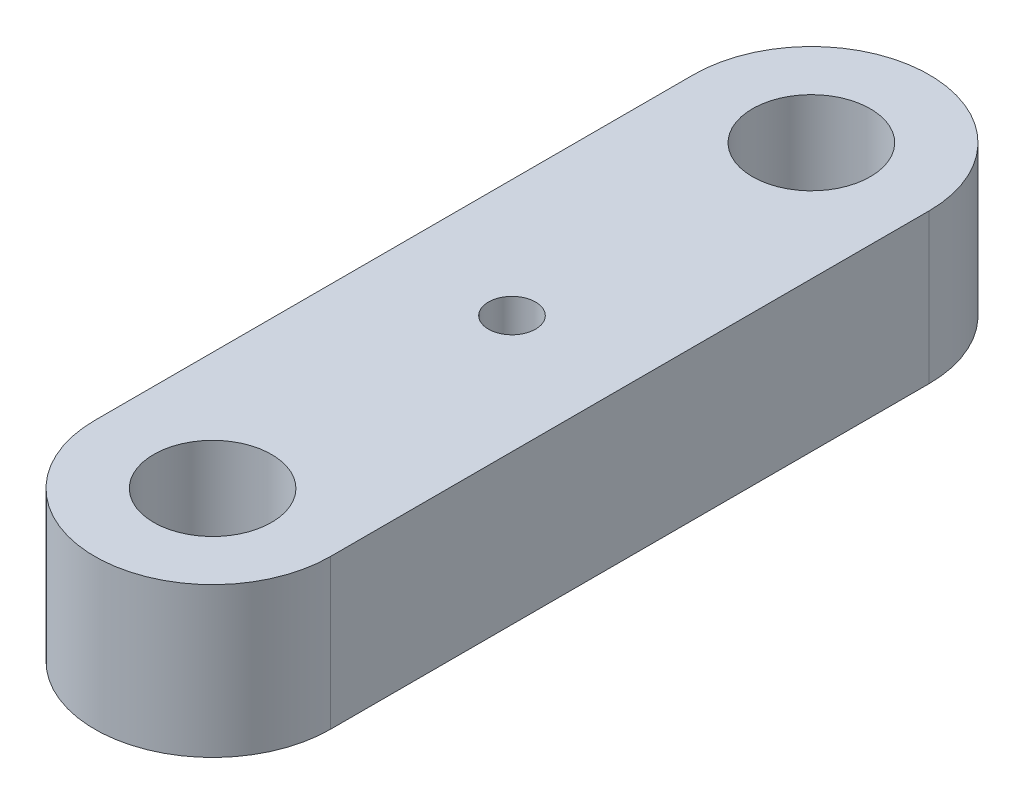
ISO-10303-21;
HEADER;
FILE_DESCRIPTION(('STEP AP214'),'2;1');
FILE_NAME('part.step','',(''),(''),'','','');
FILE_SCHEMA(('AUTOMOTIVE_DESIGN { 1 0 10303 214 1 1 1 1 }'));
ENDSEC;
DATA;
#1=APPLICATION_CONTEXT('core data for automotive mechanical design processes');
#2=APPLICATION_PROTOCOL_DEFINITION('international standard','automotive_design',2000,#1);
#3=PRODUCT_CONTEXT('',#1,'mechanical');
#4=PRODUCT('Part','Part','',(#3));
#5=PRODUCT_RELATED_PRODUCT_CATEGORY('part','',(#4));
#6=PRODUCT_DEFINITION_FORMATION('','',#4);
#7=PRODUCT_DEFINITION_CONTEXT('part definition',#1,'design');
#8=PRODUCT_DEFINITION('design','',#6,#7);
#9=PRODUCT_DEFINITION_SHAPE('','',#8);
#10=(LENGTH_UNIT() NAMED_UNIT(*) SI_UNIT(.MILLI.,.METRE.));
#11=(NAMED_UNIT(*) PLANE_ANGLE_UNIT() SI_UNIT($,.RADIAN.));
#12=(NAMED_UNIT(*) SI_UNIT($,.STERADIAN.) SOLID_ANGLE_UNIT());
#13=UNCERTAINTY_MEASURE_WITH_UNIT(LENGTH_MEASURE(1.E-05),#10,'distance_accuracy_value','');
#14=(GEOMETRIC_REPRESENTATION_CONTEXT(3) GLOBAL_UNCERTAINTY_ASSIGNED_CONTEXT((#13)) GLOBAL_UNIT_ASSIGNED_CONTEXT((#10,
#11,#12)) REPRESENTATION_CONTEXT('',''));
#15=CARTESIAN_POINT('',(0.,0.,0.));
#16=DIRECTION('',(0.,0.,1.));
#17=DIRECTION('',(1.,0.,0.));
#18=AXIS2_PLACEMENT_3D('',#15,#16,#17);
#19=CARTESIAN_POINT('',(0.,3.175,6.35));
#20=DIRECTION('',(0.,1.,0.));
#21=DIRECTION('',(0.,0.,1.));
#22=AXIS2_PLACEMENT_3D('',#19,#20,#21);
#23=PLANE('',#22);
#24=CARTESIAN_POINT('',(0.,3.175,6.35));
#25=DIRECTION('',(0.,1.,0.));
#26=DIRECTION('',(0.,0.,1.));
#27=AXIS2_PLACEMENT_3D('',#24,#25,#26);
#28=CIRCLE('',#27,1.25);
#29=CARTESIAN_POINT('',(0.,3.175,7.6));
#30=VERTEX_POINT('',#29);
#31=EDGE_CURVE('E134',#30,#30,#28,.T.);
#32=ORIENTED_EDGE('',*,*,#31,.F.);
#33=EDGE_LOOP('',(#32));
#34=FACE_BOUND('',#33,.T.);
#35=CARTESIAN_POINT('',(0.,3.175,6.35));
#36=DIRECTION('',(0.,1.,0.));
#37=DIRECTION('',(0.,0.,1.));
#38=AXIS2_PLACEMENT_3D('',#35,#36,#37);
#39=CIRCLE('',#38,2.5);
#40=CARTESIAN_POINT('',(-2.5,3.175,6.35));
#41=VERTEX_POINT('',#40);
#42=CARTESIAN_POINT('',(2.5,3.175,6.35));
#43=VERTEX_POINT('',#42);
#44=EDGE_CURVE('E92',#41,#43,#39,.T.);
#45=ORIENTED_EDGE('',*,*,#44,.T.);
#46=DIRECTION('',(0.,0.,-1.));
#47=VECTOR('',#46,1.);
#48=CARTESIAN_POINT('',(2.5,3.175,6.35));
#49=LINE('',#48,#47);
#50=CARTESIAN_POINT('',(2.5,3.175,-6.35));
#51=VERTEX_POINT('',#50);
#52=EDGE_CURVE('E87',#43,#51,#49,.T.);
#53=ORIENTED_EDGE('',*,*,#52,.T.);
#54=CARTESIAN_POINT('',(0.,3.175,-6.35));
#55=DIRECTION('',(0.,1.,0.));
#56=DIRECTION('',(0.,0.,1.));
#57=AXIS2_PLACEMENT_3D('',#54,#55,#56);
#58=CIRCLE('',#57,2.5);
#59=CARTESIAN_POINT('',(-2.5,3.175,-6.35));
#60=VERTEX_POINT('',#59);
#61=EDGE_CURVE('E90',#51,#60,#58,.T.);
#62=ORIENTED_EDGE('',*,*,#61,.T.);
#63=DIRECTION('',(0.,0.,1.));
#64=VECTOR('',#63,1.);
#65=CARTESIAN_POINT('',(-2.5,3.175,6.35));
#66=LINE('',#65,#64);
#67=EDGE_CURVE('E57',#60,#41,#66,.T.);
#68=ORIENTED_EDGE('',*,*,#67,.T.);
#69=EDGE_LOOP('',(#45,#53,#62,#68));
#70=FACE_BOUND('',#69,.T.);
#71=CARTESIAN_POINT('',(0.,3.175,-6.35));
#72=DIRECTION('',(0.,1.,0.));
#73=DIRECTION('',(0.,0.,1.));
#74=AXIS2_PLACEMENT_3D('',#71,#72,#73);
#75=CIRCLE('',#74,1.25);
#76=CARTESIAN_POINT('',(0.,3.175,-5.1));
#77=VERTEX_POINT('',#76);
#78=EDGE_CURVE('E112',#77,#77,#75,.T.);
#79=ORIENTED_EDGE('',*,*,#78,.F.);
#80=EDGE_LOOP('',(#79));
#81=FACE_BOUND('',#80,.T.);
#82=CARTESIAN_POINT('',(0.,3.175,0.));
#83=DIRECTION('',(0.,1.,0.));
#84=DIRECTION('',(0.,0.,1.));
#85=AXIS2_PLACEMENT_3D('',#82,#83,#84);
#86=CIRCLE('',#85,0.5);
#87=CARTESIAN_POINT('',(0.,3.175,0.5));
#88=VERTEX_POINT('',#87);
#89=EDGE_CURVE('E142',#88,#88,#86,.T.);
#90=ORIENTED_EDGE('',*,*,#89,.F.);
#91=EDGE_LOOP('',(#90));
#92=FACE_BOUND('',#91,.T.);
#93=ADVANCED_FACE('F39',(#34,#70,#81,#92),#23,.T.);
#94=CARTESIAN_POINT('',(0.,0.,6.35));
#95=DIRECTION('',(0.,1.,0.));
#96=DIRECTION('',(0.,0.,1.));
#97=AXIS2_PLACEMENT_3D('',#94,#95,#96);
#98=PLANE('',#97);
#99=CARTESIAN_POINT('',(0.,0.,6.35));
#100=DIRECTION('',(0.,1.,0.));
#101=DIRECTION('',(0.,0.,1.));
#102=AXIS2_PLACEMENT_3D('',#99,#100,#101);
#103=CIRCLE('',#102,2.5);
#104=CARTESIAN_POINT('',(-2.5,0.,6.35));
#105=VERTEX_POINT('',#104);
#106=CARTESIAN_POINT('',(2.5,0.,6.35));
#107=VERTEX_POINT('',#106);
#108=EDGE_CURVE('E108',#105,#107,#103,.T.);
#109=ORIENTED_EDGE('',*,*,#108,.F.);
#110=DIRECTION('',(0.,0.,1.));
#111=VECTOR('',#110,1.);
#112=CARTESIAN_POINT('',(-2.5,0.,6.35));
#113=LINE('',#112,#111);
#114=CARTESIAN_POINT('',(-2.5,0.,-6.35));
#115=VERTEX_POINT('',#114);
#116=EDGE_CURVE('E80',#115,#105,#113,.T.);
#117=ORIENTED_EDGE('',*,*,#116,.F.);
#118=CARTESIAN_POINT('',(0.,0.,-6.35));
#119=DIRECTION('',(0.,1.,0.));
#120=DIRECTION('',(0.,0.,1.));
#121=AXIS2_PLACEMENT_3D('',#118,#119,#120);
#122=CIRCLE('',#121,2.5);
#123=CARTESIAN_POINT('',(2.5,0.,-6.35));
#124=VERTEX_POINT('',#123);
#125=EDGE_CURVE('E74',#124,#115,#122,.T.);
#126=ORIENTED_EDGE('',*,*,#125,.F.);
#127=DIRECTION('',(0.,0.,-1.));
#128=VECTOR('',#127,1.);
#129=CARTESIAN_POINT('',(2.5,0.,6.35));
#130=LINE('',#129,#128);
#131=EDGE_CURVE('E97',#107,#124,#130,.T.);
#132=ORIENTED_EDGE('',*,*,#131,.F.);
#133=EDGE_LOOP('',(#109,#117,#126,#132));
#134=FACE_BOUND('',#133,.T.);
#135=CARTESIAN_POINT('',(0.,0.,-6.35));
#136=DIRECTION('',(0.,1.,0.));
#137=DIRECTION('',(0.,0.,1.));
#138=AXIS2_PLACEMENT_3D('',#135,#136,#137);
#139=CIRCLE('',#138,1.25);
#140=CARTESIAN_POINT('',(0.,0.,-5.1));
#141=VERTEX_POINT('',#140);
#142=EDGE_CURVE('E130',#141,#141,#139,.T.);
#143=ORIENTED_EDGE('',*,*,#142,.T.);
#144=EDGE_LOOP('',(#143));
#145=FACE_BOUND('',#144,.T.);
#146=CARTESIAN_POINT('',(0.,0.,6.35));
#147=DIRECTION('',(0.,1.,0.));
#148=DIRECTION('',(0.,0.,1.));
#149=AXIS2_PLACEMENT_3D('',#146,#147,#148);
#150=CIRCLE('',#149,1.25);
#151=CARTESIAN_POINT('',(0.,0.,7.6));
#152=VERTEX_POINT('',#151);
#153=EDGE_CURVE('E138',#152,#152,#150,.T.);
#154=ORIENTED_EDGE('',*,*,#153,.T.);
#155=EDGE_LOOP('',(#154));
#156=FACE_BOUND('',#155,.T.);
#157=CARTESIAN_POINT('',(0.,0.,0.));
#158=DIRECTION('',(0.,1.,0.));
#159=DIRECTION('',(0.,0.,1.));
#160=AXIS2_PLACEMENT_3D('',#157,#158,#159);
#161=CIRCLE('',#160,0.5);
#162=CARTESIAN_POINT('',(0.,0.,0.5));
#163=VERTEX_POINT('',#162);
#164=EDGE_CURVE('E146',#163,#163,#161,.T.);
#165=ORIENTED_EDGE('',*,*,#164,.T.);
#166=EDGE_LOOP('',(#165));
#167=FACE_BOUND('',#166,.T.);
#168=ADVANCED_FACE('F125',(#134,#145,#156,#167),#98,.F.);
#169=CARTESIAN_POINT('',(0.,3.175,6.35));
#170=DIRECTION('',(0.,-1.,0.));
#171=DIRECTION('',(0.,0.,-1.));
#172=AXIS2_PLACEMENT_3D('',#169,#170,#171);
#173=CYLINDRICAL_SURFACE('',#172,2.5);
#174=ORIENTED_EDGE('',*,*,#108,.T.);
#175=DIRECTION('',(0.,-1.,0.));
#176=VECTOR('',#175,1.);
#177=CARTESIAN_POINT('',(2.5,3.175,6.35));
#178=LINE('',#177,#176);
#179=EDGE_CURVE('E11',#43,#107,#178,.T.);
#180=ORIENTED_EDGE('',*,*,#179,.F.);
#181=ORIENTED_EDGE('',*,*,#44,.F.);
#182=DIRECTION('',(0.,-1.,0.));
#183=VECTOR('',#182,1.);
#184=CARTESIAN_POINT('',(-2.5,3.175,6.35));
#185=LINE('',#184,#183);
#186=EDGE_CURVE('E104',#41,#105,#185,.T.);
#187=ORIENTED_EDGE('',*,*,#186,.T.);
#188=EDGE_LOOP('',(#174,#180,#181,#187));
#189=FACE_BOUND('',#188,.T.);
#190=ADVANCED_FACE('F41',(#189),#173,.T.);
#191=CARTESIAN_POINT('',(2.5,3.175,6.35));
#192=DIRECTION('',(-1.,0.,0.));
#193=DIRECTION('',(0.,0.,1.));
#194=AXIS2_PLACEMENT_3D('',#191,#192,#193);
#195=PLANE('',#194);
#196=ORIENTED_EDGE('',*,*,#131,.T.);
#197=DIRECTION('',(0.,-1.,0.));
#198=VECTOR('',#197,1.);
#199=CARTESIAN_POINT('',(2.5,3.175,-6.35));
#200=LINE('',#199,#198);
#201=EDGE_CURVE('E49',#51,#124,#200,.T.);
#202=ORIENTED_EDGE('',*,*,#201,.F.);
#203=ORIENTED_EDGE('',*,*,#52,.F.);
#204=ORIENTED_EDGE('',*,*,#179,.T.);
#205=EDGE_LOOP('',(#196,#202,#203,#204));
#206=FACE_BOUND('',#205,.T.);
#207=ADVANCED_FACE('F96',(#206),#195,.F.);
#208=CARTESIAN_POINT('',(0.,3.175,-6.35));
#209=DIRECTION('',(0.,-1.,0.));
#210=DIRECTION('',(0.,0.,-1.));
#211=AXIS2_PLACEMENT_3D('',#208,#209,#210);
#212=CYLINDRICAL_SURFACE('',#211,2.5);
#213=ORIENTED_EDGE('',*,*,#125,.T.);
#214=DIRECTION('',(0.,-1.,0.));
#215=VECTOR('',#214,1.);
#216=CARTESIAN_POINT('',(-2.5,3.175,-6.35));
#217=LINE('',#216,#215);
#218=EDGE_CURVE('E99',#60,#115,#217,.T.);
#219=ORIENTED_EDGE('',*,*,#218,.F.);
#220=ORIENTED_EDGE('',*,*,#61,.F.);
#221=ORIENTED_EDGE('',*,*,#201,.T.);
#222=EDGE_LOOP('',(#213,#219,#220,#221));
#223=FACE_BOUND('',#222,.T.);
#224=ADVANCED_FACE('F100',(#223),#212,.T.);
#225=CARTESIAN_POINT('',(-2.5,3.175,6.35));
#226=DIRECTION('',(1.,0.,0.));
#227=DIRECTION('',(0.,0.,-1.));
#228=AXIS2_PLACEMENT_3D('',#225,#226,#227);
#229=PLANE('',#228);
#230=ORIENTED_EDGE('',*,*,#116,.T.);
#231=ORIENTED_EDGE('',*,*,#186,.F.);
#232=ORIENTED_EDGE('',*,*,#67,.F.);
#233=ORIENTED_EDGE('',*,*,#218,.T.);
#234=EDGE_LOOP('',(#230,#231,#232,#233));
#235=FACE_BOUND('',#234,.T.);
#236=ADVANCED_FACE('F122',(#235),#229,.F.);
#237=CARTESIAN_POINT('',(0.,3.175,-6.35));
#238=DIRECTION('',(0.,-1.,0.));
#239=DIRECTION('',(0.,0.,-1.));
#240=AXIS2_PLACEMENT_3D('',#237,#238,#239);
#241=CYLINDRICAL_SURFACE('',#240,1.25);
#242=ORIENTED_EDGE('',*,*,#78,.T.);
#243=EDGE_LOOP('',(#242));
#244=FACE_BOUND('',#243,.T.);
#245=ORIENTED_EDGE('',*,*,#142,.F.);
#246=EDGE_LOOP('',(#245));
#247=FACE_BOUND('',#246,.T.);
#248=ADVANCED_FACE('F166',(#244,#247),#241,.F.);
#249=CARTESIAN_POINT('',(0.,3.175,6.35));
#250=DIRECTION('',(0.,-1.,0.));
#251=DIRECTION('',(0.,0.,-1.));
#252=AXIS2_PLACEMENT_3D('',#249,#250,#251);
#253=CYLINDRICAL_SURFACE('',#252,1.25);
#254=ORIENTED_EDGE('',*,*,#31,.T.);
#255=EDGE_LOOP('',(#254));
#256=FACE_BOUND('',#255,.T.);
#257=ORIENTED_EDGE('',*,*,#153,.F.);
#258=EDGE_LOOP('',(#257));
#259=FACE_BOUND('',#258,.T.);
#260=ADVANCED_FACE('F212',(#256,#259),#253,.F.);
#261=CARTESIAN_POINT('',(0.,3.175,0.));
#262=DIRECTION('',(0.,-1.,0.));
#263=DIRECTION('',(0.,0.,-1.));
#264=AXIS2_PLACEMENT_3D('',#261,#262,#263);
#265=CYLINDRICAL_SURFACE('',#264,0.5);
#266=ORIENTED_EDGE('',*,*,#89,.T.);
#267=EDGE_LOOP('',(#266));
#268=FACE_BOUND('',#267,.T.);
#269=ORIENTED_EDGE('',*,*,#164,.F.);
#270=EDGE_LOOP('',(#269));
#271=FACE_BOUND('',#270,.T.);
#272=ADVANCED_FACE('F154',(#268,#271),#265,.F.);
#273=CLOSED_SHELL('',(#93,#168,#190,#207,#224,#236,#248,#260,#272));
#274=MANIFOLD_SOLID_BREP('B2',#273);
#275=ADVANCED_BREP_SHAPE_REPRESENTATION('',(#18,#274),#14);
#276=SHAPE_DEFINITION_REPRESENTATION(#9,#275);
ENDSEC;
END-ISO-10303-21;
